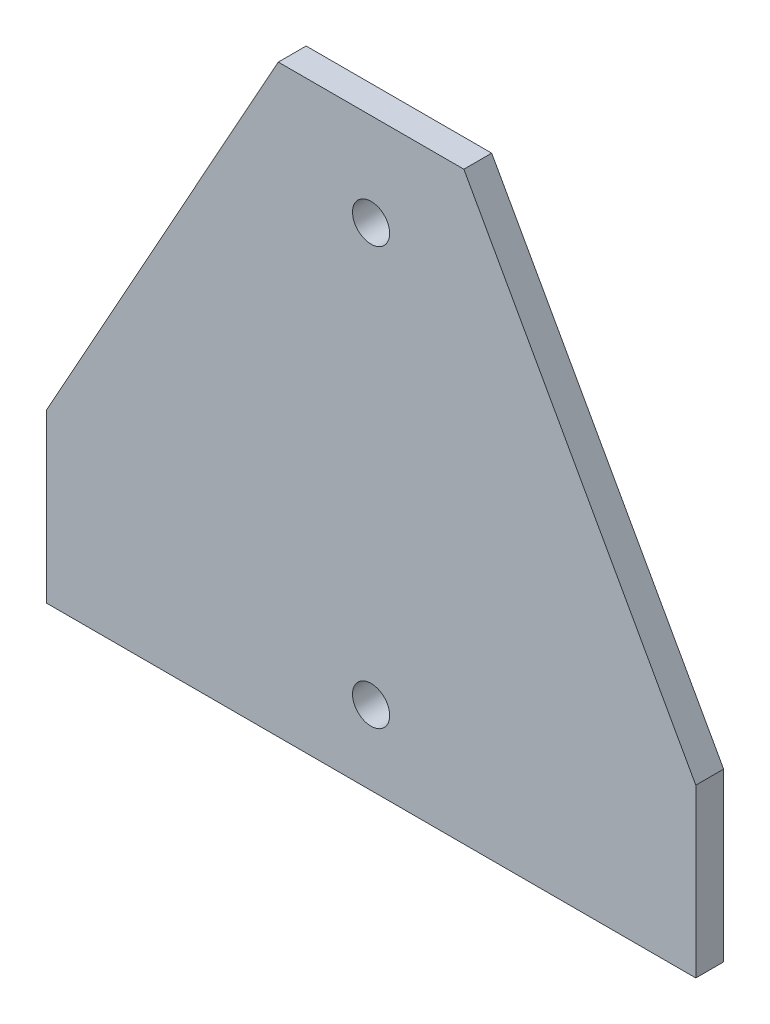
ISO-10303-21;
HEADER;
FILE_DESCRIPTION(('STEP AP214'),'2;1');
FILE_NAME('part.step','',(''),(''),'','','');
FILE_SCHEMA(('AUTOMOTIVE_DESIGN { 1 0 10303 214 1 1 1 1 }'));
ENDSEC;
DATA;
#1=APPLICATION_CONTEXT('core data for automotive mechanical design processes');
#2=APPLICATION_PROTOCOL_DEFINITION('international standard','automotive_design',2000,#1);
#3=PRODUCT_CONTEXT('',#1,'mechanical');
#4=PRODUCT('Part','Part','',(#3));
#5=PRODUCT_RELATED_PRODUCT_CATEGORY('part','',(#4));
#6=PRODUCT_DEFINITION_FORMATION('','',#4);
#7=PRODUCT_DEFINITION_CONTEXT('part definition',#1,'design');
#8=PRODUCT_DEFINITION('design','',#6,#7);
#9=PRODUCT_DEFINITION_SHAPE('','',#8);
#10=(LENGTH_UNIT() NAMED_UNIT(*) SI_UNIT(.MILLI.,.METRE.));
#11=(NAMED_UNIT(*) PLANE_ANGLE_UNIT() SI_UNIT($,.RADIAN.));
#12=(NAMED_UNIT(*) SI_UNIT($,.STERADIAN.) SOLID_ANGLE_UNIT());
#13=UNCERTAINTY_MEASURE_WITH_UNIT(LENGTH_MEASURE(1.E-05),#10,'distance_accuracy_value','');
#14=(GEOMETRIC_REPRESENTATION_CONTEXT(3) GLOBAL_UNCERTAINTY_ASSIGNED_CONTEXT((#13)) GLOBAL_UNIT_ASSIGNED_CONTEXT((#10,
#11,#12)) REPRESENTATION_CONTEXT('',''));
#15=CARTESIAN_POINT('',(0.,0.,0.));
#16=DIRECTION('',(0.,0.,1.));
#17=DIRECTION('',(1.,0.,0.));
#18=AXIS2_PLACEMENT_3D('',#15,#16,#17);
#19=CARTESIAN_POINT('',(61.1320754716981,33.9622641509434,3.));
#20=DIRECTION('',(0.874157276121538,0.485642931178632,0.));
#21=DIRECTION('',(-0.485642931178632,0.874157276121538,0.));
#22=AXIS2_PLACEMENT_3D('',#19,#20,#21);
#23=PLANE('',#22);
#24=DIRECTION('',(0.485642931178632,-0.874157276121538,0.));
#25=VECTOR('',#24,1.);
#26=CARTESIAN_POINT('',(61.1320754716981,33.9622641509434,0.));
#27=LINE('',#26,#25);
#28=CARTESIAN_POINT('',(45.,63.,0.));
#29=VERTEX_POINT('',#28);
#30=CARTESIAN_POINT('',(70.,18.,0.));
#31=VERTEX_POINT('',#30);
#32=EDGE_CURVE('E130',#29,#31,#27,.T.);
#33=ORIENTED_EDGE('',*,*,#32,.F.);
#34=DIRECTION('',(0.,0.,-1.));
#35=VECTOR('',#34,1.);
#36=CARTESIAN_POINT('',(45.,63.,3.));
#37=LINE('',#36,#35);
#38=CARTESIAN_POINT('',(45.,63.,3.));
#39=VERTEX_POINT('',#38);
#40=EDGE_CURVE('E11',#39,#29,#37,.T.);
#41=ORIENTED_EDGE('',*,*,#40,.F.);
#42=DIRECTION('',(0.485642931178632,-0.874157276121538,0.));
#43=VECTOR('',#42,1.);
#44=CARTESIAN_POINT('',(61.1320754716981,33.9622641509434,3.));
#45=LINE('',#44,#43);
#46=CARTESIAN_POINT('',(70.,18.,3.));
#47=VERTEX_POINT('',#46);
#48=EDGE_CURVE('E190',#39,#47,#45,.T.);
#49=ORIENTED_EDGE('',*,*,#48,.T.);
#50=DIRECTION('',(0.,0.,-1.));
#51=VECTOR('',#50,1.);
#52=CARTESIAN_POINT('',(70.,18.,3.));
#53=LINE('',#52,#51);
#54=EDGE_CURVE('E83',#47,#31,#53,.T.);
#55=ORIENTED_EDGE('',*,*,#54,.T.);
#56=EDGE_LOOP('',(#33,#41,#49,#55));
#57=FACE_BOUND('',#56,.T.);
#58=ADVANCED_FACE('F37',(#57),#23,.T.);
#59=CARTESIAN_POINT('',(0.,63.,3.));
#60=DIRECTION('',(0.,1.,0.));
#61=DIRECTION('',(0.,0.,1.));
#62=AXIS2_PLACEMENT_3D('',#59,#60,#61);
#63=PLANE('',#62);
#64=DIRECTION('',(1.,0.,0.));
#65=VECTOR('',#64,1.);
#66=CARTESIAN_POINT('',(0.,63.,0.));
#67=LINE('',#66,#65);
#68=CARTESIAN_POINT('',(25.,63.,0.));
#69=VERTEX_POINT('',#68);
#70=EDGE_CURVE('E132',#69,#29,#67,.T.);
#71=ORIENTED_EDGE('',*,*,#70,.F.);
#72=DIRECTION('',(0.,0.,-1.));
#73=VECTOR('',#72,1.);
#74=CARTESIAN_POINT('',(25.,63.,3.));
#75=LINE('',#74,#73);
#76=CARTESIAN_POINT('',(25.,63.,3.));
#77=VERTEX_POINT('',#76);
#78=EDGE_CURVE('E46',#77,#69,#75,.T.);
#79=ORIENTED_EDGE('',*,*,#78,.F.);
#80=DIRECTION('',(1.,0.,0.));
#81=VECTOR('',#80,1.);
#82=CARTESIAN_POINT('',(0.,63.,3.));
#83=LINE('',#82,#81);
#84=EDGE_CURVE('E119',#77,#39,#83,.T.);
#85=ORIENTED_EDGE('',*,*,#84,.T.);
#86=ORIENTED_EDGE('',*,*,#40,.T.);
#87=EDGE_LOOP('',(#71,#79,#85,#86));
#88=FACE_BOUND('',#87,.T.);
#89=ADVANCED_FACE('F154',(#88),#63,.T.);
#90=CARTESIAN_POINT('',(-7.64150943396226,4.24528301886792,3.));
#91=DIRECTION('',(-0.874157276121538,0.485642931178632,0.));
#92=DIRECTION('',(-0.485642931178632,-0.874157276121538,0.));
#93=AXIS2_PLACEMENT_3D('',#90,#91,#92);
#94=PLANE('',#93);
#95=DIRECTION('',(0.485642931178632,0.874157276121538,0.));
#96=VECTOR('',#95,1.);
#97=CARTESIAN_POINT('',(-7.64150943396226,4.24528301886792,0.));
#98=LINE('',#97,#96);
#99=CARTESIAN_POINT('',(0.,18.,0.));
#100=VERTEX_POINT('',#99);
#101=EDGE_CURVE('E135',#100,#69,#98,.T.);
#102=ORIENTED_EDGE('',*,*,#101,.F.);
#103=DIRECTION('',(0.,0.,-1.));
#104=VECTOR('',#103,1.);
#105=CARTESIAN_POINT('',(0.,18.,3.));
#106=LINE('',#105,#104);
#107=CARTESIAN_POINT('',(0.,18.,3.));
#108=VERTEX_POINT('',#107);
#109=EDGE_CURVE('E105',#108,#100,#106,.T.);
#110=ORIENTED_EDGE('',*,*,#109,.F.);
#111=DIRECTION('',(0.485642931178632,0.874157276121538,0.));
#112=VECTOR('',#111,1.);
#113=CARTESIAN_POINT('',(-7.64150943396226,4.24528301886792,3.));
#114=LINE('',#113,#112);
#115=EDGE_CURVE('E117',#108,#77,#114,.T.);
#116=ORIENTED_EDGE('',*,*,#115,.T.);
#117=ORIENTED_EDGE('',*,*,#78,.T.);
#118=EDGE_LOOP('',(#102,#110,#116,#117));
#119=FACE_BOUND('',#118,.T.);
#120=ADVANCED_FACE('F151',(#119),#94,.T.);
#121=CARTESIAN_POINT('',(0.,0.,3.));
#122=DIRECTION('',(-1.,0.,0.));
#123=DIRECTION('',(0.,0.,1.));
#124=AXIS2_PLACEMENT_3D('',#121,#122,#123);
#125=PLANE('',#124);
#126=DIRECTION('',(0.,1.,0.));
#127=VECTOR('',#126,1.);
#128=CARTESIAN_POINT('',(0.,0.,0.));
#129=LINE('',#128,#127);
#130=CARTESIAN_POINT('',(0.,0.,0.));
#131=VERTEX_POINT('',#130);
#132=EDGE_CURVE('E102',#131,#100,#129,.T.);
#133=ORIENTED_EDGE('',*,*,#132,.F.);
#134=DIRECTION('',(0.,0.,-1.));
#135=VECTOR('',#134,1.);
#136=CARTESIAN_POINT('',(0.,0.,3.));
#137=LINE('',#136,#135);
#138=CARTESIAN_POINT('',(0.,0.,3.));
#139=VERTEX_POINT('',#138);
#140=EDGE_CURVE('E96',#139,#131,#137,.T.);
#141=ORIENTED_EDGE('',*,*,#140,.F.);
#142=DIRECTION('',(0.,1.,0.));
#143=VECTOR('',#142,1.);
#144=CARTESIAN_POINT('',(0.,0.,3.));
#145=LINE('',#144,#143);
#146=EDGE_CURVE('E100',#139,#108,#145,.T.);
#147=ORIENTED_EDGE('',*,*,#146,.T.);
#148=ORIENTED_EDGE('',*,*,#109,.T.);
#149=EDGE_LOOP('',(#133,#141,#147,#148));
#150=FACE_BOUND('',#149,.T.);
#151=ADVANCED_FACE('F98',(#150),#125,.T.);
#152=CARTESIAN_POINT('',(0.,0.,3.));
#153=DIRECTION('',(0.,1.,0.));
#154=DIRECTION('',(0.,0.,1.));
#155=AXIS2_PLACEMENT_3D('',#152,#153,#154);
#156=PLANE('',#155);
#157=DIRECTION('',(1.,0.,0.));
#158=VECTOR('',#157,1.);
#159=CARTESIAN_POINT('',(0.,0.,0.));
#160=LINE('',#159,#158);
#161=CARTESIAN_POINT('',(70.,0.,0.));
#162=VERTEX_POINT('',#161);
#163=EDGE_CURVE('E139',#131,#162,#160,.T.);
#164=ORIENTED_EDGE('',*,*,#163,.T.);
#165=DIRECTION('',(0.,0.,-1.));
#166=VECTOR('',#165,1.);
#167=CARTESIAN_POINT('',(70.,0.,3.));
#168=LINE('',#167,#166);
#169=CARTESIAN_POINT('',(70.,0.,3.));
#170=VERTEX_POINT('',#169);
#171=EDGE_CURVE('E106',#170,#162,#168,.T.);
#172=ORIENTED_EDGE('',*,*,#171,.F.);
#173=DIRECTION('',(1.,0.,0.));
#174=VECTOR('',#173,1.);
#175=CARTESIAN_POINT('',(0.,0.,3.));
#176=LINE('',#175,#174);
#177=EDGE_CURVE('E109',#139,#170,#176,.T.);
#178=ORIENTED_EDGE('',*,*,#177,.F.);
#179=ORIENTED_EDGE('',*,*,#140,.T.);
#180=EDGE_LOOP('',(#164,#172,#178,#179));
#181=FACE_BOUND('',#180,.T.);
#182=ADVANCED_FACE('F110',(#181),#156,.F.);
#183=CARTESIAN_POINT('',(70.,0.,3.));
#184=DIRECTION('',(-1.,0.,0.));
#185=DIRECTION('',(0.,0.,1.));
#186=AXIS2_PLACEMENT_3D('',#183,#184,#185);
#187=PLANE('',#186);
#188=DIRECTION('',(0.,1.,0.));
#189=VECTOR('',#188,1.);
#190=CARTESIAN_POINT('',(70.,0.,0.));
#191=LINE('',#190,#189);
#192=EDGE_CURVE('E76',#162,#31,#191,.T.);
#193=ORIENTED_EDGE('',*,*,#192,.T.);
#194=ORIENTED_EDGE('',*,*,#54,.F.);
#195=DIRECTION('',(0.,1.,0.));
#196=VECTOR('',#195,1.);
#197=CARTESIAN_POINT('',(70.,0.,3.));
#198=LINE('',#197,#196);
#199=EDGE_CURVE('E54',#170,#47,#198,.T.);
#200=ORIENTED_EDGE('',*,*,#199,.F.);
#201=ORIENTED_EDGE('',*,*,#171,.T.);
#202=EDGE_LOOP('',(#193,#194,#200,#201));
#203=FACE_BOUND('',#202,.T.);
#204=ADVANCED_FACE('F172',(#203),#187,.F.);
#205=CARTESIAN_POINT('',(35.,53.,3.));
#206=DIRECTION('',(0.,0.,-1.));
#207=DIRECTION('',(-1.,0.,0.));
#208=AXIS2_PLACEMENT_3D('',#205,#206,#207);
#209=CYLINDRICAL_SURFACE('',#208,2.);
#210=CARTESIAN_POINT('',(35.,53.,3.));
#211=DIRECTION('',(0.,0.,1.));
#212=DIRECTION('',(1.,0.,0.));
#213=AXIS2_PLACEMENT_3D('',#210,#211,#212);
#214=CIRCLE('',#213,2.);
#215=CARTESIAN_POINT('',(37.,53.,3.));
#216=VERTEX_POINT('',#215);
#217=EDGE_CURVE('E145',#216,#216,#214,.T.);
#218=ORIENTED_EDGE('',*,*,#217,.T.);
#219=EDGE_LOOP('',(#218));
#220=FACE_BOUND('',#219,.T.);
#221=CARTESIAN_POINT('',(35.,53.,0.));
#222=DIRECTION('',(0.,0.,1.));
#223=DIRECTION('',(1.,0.,0.));
#224=AXIS2_PLACEMENT_3D('',#221,#222,#223);
#225=CIRCLE('',#224,2.);
#226=CARTESIAN_POINT('',(37.,53.,0.));
#227=VERTEX_POINT('',#226);
#228=EDGE_CURVE('E127',#227,#227,#225,.T.);
#229=ORIENTED_EDGE('',*,*,#228,.F.);
#230=EDGE_LOOP('',(#229));
#231=FACE_BOUND('',#230,.T.);
#232=ADVANCED_FACE('F39',(#220,#231),#209,.F.);
#233=CARTESIAN_POINT('',(35.,8.,3.));
#234=DIRECTION('',(0.,0.,-1.));
#235=DIRECTION('',(-1.,0.,0.));
#236=AXIS2_PLACEMENT_3D('',#233,#234,#235);
#237=CYLINDRICAL_SURFACE('',#236,2.);
#238=CARTESIAN_POINT('',(35.,8.,3.));
#239=DIRECTION('',(0.,0.,1.));
#240=DIRECTION('',(1.,0.,0.));
#241=AXIS2_PLACEMENT_3D('',#238,#239,#240);
#242=CIRCLE('',#241,2.);
#243=CARTESIAN_POINT('',(37.,8.,3.));
#244=VERTEX_POINT('',#243);
#245=EDGE_CURVE('E124',#244,#244,#242,.T.);
#246=ORIENTED_EDGE('',*,*,#245,.T.);
#247=EDGE_LOOP('',(#246));
#248=FACE_BOUND('',#247,.T.);
#249=CARTESIAN_POINT('',(35.,8.,0.));
#250=DIRECTION('',(0.,0.,1.));
#251=DIRECTION('',(1.,0.,0.));
#252=AXIS2_PLACEMENT_3D('',#249,#250,#251);
#253=CIRCLE('',#252,2.);
#254=CARTESIAN_POINT('',(37.,8.,0.));
#255=VERTEX_POINT('',#254);
#256=EDGE_CURVE('E142',#255,#255,#253,.T.);
#257=ORIENTED_EDGE('',*,*,#256,.F.);
#258=EDGE_LOOP('',(#257));
#259=FACE_BOUND('',#258,.T.);
#260=ADVANCED_FACE('F162',(#248,#259),#237,.F.);
#261=CARTESIAN_POINT('',(0.,0.,3.));
#262=DIRECTION('',(0.,0.,1.));
#263=DIRECTION('',(1.,0.,0.));
#264=AXIS2_PLACEMENT_3D('',#261,#262,#263);
#265=PLANE('',#264);
#266=ORIENTED_EDGE('',*,*,#217,.F.);
#267=EDGE_LOOP('',(#266));
#268=FACE_BOUND('',#267,.T.);
#269=ORIENTED_EDGE('',*,*,#48,.F.);
#270=ORIENTED_EDGE('',*,*,#84,.F.);
#271=ORIENTED_EDGE('',*,*,#115,.F.);
#272=ORIENTED_EDGE('',*,*,#146,.F.);
#273=ORIENTED_EDGE('',*,*,#177,.T.);
#274=ORIENTED_EDGE('',*,*,#199,.T.);
#275=EDGE_LOOP('',(#269,#270,#271,#272,#273,#274));
#276=FACE_BOUND('',#275,.T.);
#277=ORIENTED_EDGE('',*,*,#245,.F.);
#278=EDGE_LOOP('',(#277));
#279=FACE_BOUND('',#278,.T.);
#280=ADVANCED_FACE('F113',(#268,#276,#279),#265,.T.);
#281=CARTESIAN_POINT('',(0.,0.,0.));
#282=DIRECTION('',(0.,0.,1.));
#283=DIRECTION('',(1.,0.,0.));
#284=AXIS2_PLACEMENT_3D('',#281,#282,#283);
#285=PLANE('',#284);
#286=ORIENTED_EDGE('',*,*,#228,.T.);
#287=EDGE_LOOP('',(#286));
#288=FACE_BOUND('',#287,.T.);
#289=ORIENTED_EDGE('',*,*,#32,.T.);
#290=ORIENTED_EDGE('',*,*,#192,.F.);
#291=ORIENTED_EDGE('',*,*,#163,.F.);
#292=ORIENTED_EDGE('',*,*,#132,.T.);
#293=ORIENTED_EDGE('',*,*,#101,.T.);
#294=ORIENTED_EDGE('',*,*,#70,.T.);
#295=EDGE_LOOP('',(#289,#290,#291,#292,#293,#294));
#296=FACE_BOUND('',#295,.T.);
#297=ORIENTED_EDGE('',*,*,#256,.T.);
#298=EDGE_LOOP('',(#297));
#299=FACE_BOUND('',#298,.T.);
#300=ADVANCED_FACE('F155',(#288,#296,#299),#285,.F.);
#301=CLOSED_SHELL('',(#58,#89,#120,#151,#182,#204,#232,#260,#280,#300));
#302=MANIFOLD_SOLID_BREP('B2',#301);
#303=ADVANCED_BREP_SHAPE_REPRESENTATION('',(#18,#302),#14);
#304=SHAPE_DEFINITION_REPRESENTATION(#9,#303);
ENDSEC;
END-ISO-10303-21;
